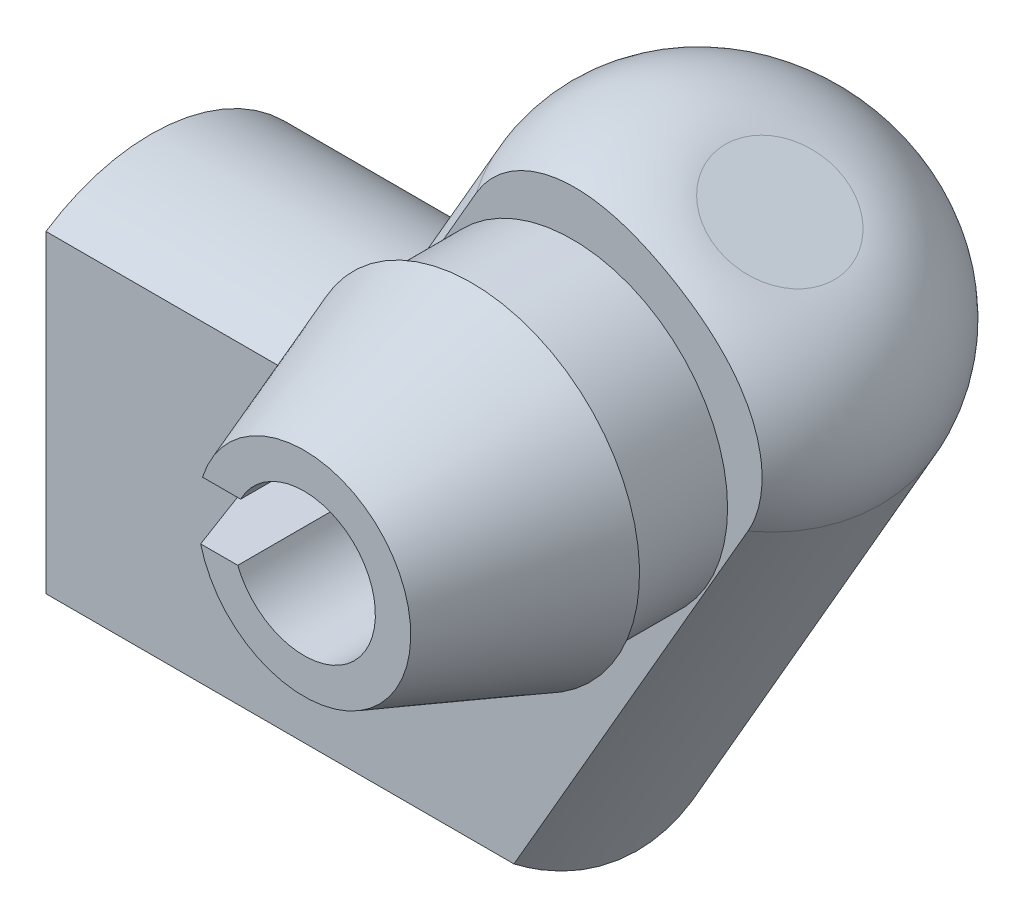
ISO-10303-21;
HEADER;
FILE_DESCRIPTION(('STEP AP214'),'2;1');
FILE_NAME('part.step','',(''),(''),'','','');
FILE_SCHEMA(('AUTOMOTIVE_DESIGN { 1 0 10303 214 1 1 1 1 }'));
ENDSEC;
DATA;
#1=APPLICATION_CONTEXT('core data for automotive mechanical design processes');
#2=APPLICATION_PROTOCOL_DEFINITION('international standard','automotive_design',2000,#1);
#3=PRODUCT_CONTEXT('',#1,'mechanical');
#4=PRODUCT('Part','Part','',(#3));
#5=PRODUCT_RELATED_PRODUCT_CATEGORY('part','',(#4));
#6=PRODUCT_DEFINITION_FORMATION('','',#4);
#7=PRODUCT_DEFINITION_CONTEXT('part definition',#1,'design');
#8=PRODUCT_DEFINITION('design','',#6,#7);
#9=PRODUCT_DEFINITION_SHAPE('','',#8);
#10=(LENGTH_UNIT() NAMED_UNIT(*) SI_UNIT(.MILLI.,.METRE.));
#11=(NAMED_UNIT(*) PLANE_ANGLE_UNIT() SI_UNIT($,.RADIAN.));
#12=(NAMED_UNIT(*) SI_UNIT($,.STERADIAN.) SOLID_ANGLE_UNIT());
#13=UNCERTAINTY_MEASURE_WITH_UNIT(LENGTH_MEASURE(1.E-05),#10,'distance_accuracy_value','');
#14=(GEOMETRIC_REPRESENTATION_CONTEXT(3) GLOBAL_UNCERTAINTY_ASSIGNED_CONTEXT((#13)) GLOBAL_UNIT_ASSIGNED_CONTEXT((#10,
#11,#12)) REPRESENTATION_CONTEXT('',''));
#15=CARTESIAN_POINT('',(0.,0.,0.));
#16=DIRECTION('',(0.,0.,1.));
#17=DIRECTION('',(1.,0.,0.));
#18=AXIS2_PLACEMENT_3D('',#15,#16,#17);
#19=CARTESIAN_POINT('',(3.,5.19615242270663,-20.));
#20=DIRECTION('',(0.5,0.866025403784439,0.));
#21=DIRECTION('',(0.,0.,1.));
#22=AXIS2_PLACEMENT_3D('',#19,#20,#21);
#23=PLANE('',#22);
#24=CARTESIAN_POINT('',(3.,5.19615242270663,-20.));
#25=DIRECTION('',(-0.5,-0.866025403784439,0.));
#26=DIRECTION('',(-0.866025403784439,0.5,0.));
#27=AXIS2_PLACEMENT_3D('',#24,#25,#26);
#28=CIRCLE('',#27,0.749999999999999);
#29=CARTESIAN_POINT('',(2.35048094716167,5.57115242270663,-20.));
#30=VERTEX_POINT('',#29);
#31=EDGE_CURVE('E203',#30,#30,#28,.T.);
#32=ORIENTED_EDGE('',*,*,#31,.F.);
#33=EDGE_LOOP('',(#32));
#34=FACE_BOUND('',#33,.T.);
#35=ADVANCED_FACE('F50',(#34),#23,.T.);
#36=CARTESIAN_POINT('',(-4.5,0.,-20.));
#37=DIRECTION('',(1.,0.,0.));
#38=DIRECTION('',(0.,0.,1.));
#39=AXIS2_PLACEMENT_3D('',#36,#37,#38);
#40=PLANE('',#39);
#41=CARTESIAN_POINT('',(-4.5,0.,-20.));
#42=DIRECTION('',(-1.,0.,0.));
#43=DIRECTION('',(0.,0.,1.));
#44=AXIS2_PLACEMENT_3D('',#41,#42,#43);
#45=CIRCLE('',#44,1.125);
#46=CARTESIAN_POINT('',(-4.5,0.,-18.875));
#47=VERTEX_POINT('',#46);
#48=EDGE_CURVE('E191',#47,#47,#45,.T.);
#49=ORIENTED_EDGE('',*,*,#48,.F.);
#50=EDGE_LOOP('',(#49));
#51=FACE_BOUND('',#50,.T.);
#52=CARTESIAN_POINT('',(-4.5,0.,-20.));
#53=DIRECTION('',(-1.,0.,0.));
#54=DIRECTION('',(0.,0.,1.));
#55=AXIS2_PLACEMENT_3D('',#52,#53,#54);
#56=CIRCLE('',#55,2.25);
#57=CARTESIAN_POINT('',(-4.5,1.87082869338697,-18.75));
#58=VERTEX_POINT('',#57);
#59=CARTESIAN_POINT('',(-4.5,-1.87082869338697,-18.75));
#60=VERTEX_POINT('',#59);
#61=EDGE_CURVE('E195',#58,#60,#56,.T.);
#62=ORIENTED_EDGE('',*,*,#61,.T.);
#63=DIRECTION('',(0.,-1.,0.));
#64=VECTOR('',#63,1.);
#65=CARTESIAN_POINT('',(-4.5,0.,-18.75));
#66=LINE('',#65,#64);
#67=EDGE_CURVE('E183',#58,#60,#66,.T.);
#68=ORIENTED_EDGE('',*,*,#67,.F.);
#69=EDGE_LOOP('',(#62,#68));
#70=FACE_BOUND('',#69,.T.);
#71=ADVANCED_FACE('F237',(#51,#70),#40,.F.);
#72=CARTESIAN_POINT('',(-1.47894191624432,-2.56160254037844,-20.));
#73=DIRECTION('',(0.5,0.866025403784439,0.));
#74=DIRECTION('',(-0.866025403784439,0.5,0.));
#75=AXIS2_PLACEMENT_3D('',#72,#73,#74);
#76=CYLINDRICAL_SURFACE('',#75,2.25);
#77=DIRECTION('',(0.5,0.866025403784439,0.));
#78=VECTOR('',#77,1.);
#79=CARTESIAN_POINT('',(0.141243258357642,-3.49701688707193,-18.75));
#80=LINE('',#79,#78);
#81=CARTESIAN_POINT('',(3.87018517460236,2.96169997032885,-18.75));
#82=VERTEX_POINT('',#81);
#83=CARTESIAN_POINT('',(1.08012344973464,-1.87082869338697,-18.75));
#84=VERTEX_POINT('',#83);
#85=EDGE_CURVE('E173',#82,#84,#80,.F.);
#86=ORIENTED_EDGE('',*,*,#85,.T.);
#87=CARTESIAN_POINT('',(0.,0.,-20.));
#88=DIRECTION('',(-0.866025403784439,-0.5,0.));
#89=DIRECTION('',(0.5,-0.866025403784439,0.));
#90=AXIS2_PLACEMENT_3D('',#87,#88,#89);
#91=ELLIPSE('',#90,2.59807621135332,2.25);
#92=CARTESIAN_POINT('',(-1.08012344973464,1.87082869338697,-18.75));
#93=VERTEX_POINT('',#92);
#94=EDGE_CURVE('E199',#84,#93,#91,.F.);
#95=ORIENTED_EDGE('',*,*,#94,.T.);
#96=DIRECTION('',(0.5,0.866025403784439,0.));
#97=VECTOR('',#96,1.);
#98=CARTESIAN_POINT('',(-3.09912709084629,-1.62618819368496,-18.75));
#99=LINE('',#98,#97);
#100=CARTESIAN_POINT('',(0.629814825398036,4.83252866372346,-18.75));
#101=VERTEX_POINT('',#100);
#102=EDGE_CURVE('E169',#93,#101,#99,.T.);
#103=ORIENTED_EDGE('',*,*,#102,.T.);
#104=CARTESIAN_POINT('',(2.25,3.89711431702997,-20.));
#105=DIRECTION('',(-0.5,-0.866025403784439,0.));
#106=DIRECTION('',(-0.866025403784439,0.5,0.));
#107=AXIS2_PLACEMENT_3D('',#104,#105,#106);
#108=CIRCLE('',#107,2.25);
#109=EDGE_CURVE('E207',#82,#101,#108,.F.);
#110=ORIENTED_EDGE('',*,*,#109,.F.);
#111=EDGE_LOOP('',(#86,#95,#103,#110));
#112=FACE_BOUND('',#111,.T.);
#113=ADVANCED_FACE('F233',(#112),#76,.T.);
#114=CARTESIAN_POINT('',(-4.5,0.,-20.));
#115=DIRECTION('',(1.,0.,0.));
#116=DIRECTION('',(0.,0.,1.));
#117=AXIS2_PLACEMENT_3D('',#114,#115,#116);
#118=CYLINDRICAL_SURFACE('',#117,2.25);
#119=DIRECTION('',(1.,0.,0.));
#120=VECTOR('',#119,1.);
#121=CARTESIAN_POINT('',(-4.5,-1.87082869338697,-18.75));
#122=LINE('',#121,#120);
#123=EDGE_CURVE('E180',#84,#60,#122,.F.);
#124=ORIENTED_EDGE('',*,*,#123,.T.);
#125=ORIENTED_EDGE('',*,*,#61,.F.);
#126=DIRECTION('',(1.,0.,0.));
#127=VECTOR('',#126,1.);
#128=CARTESIAN_POINT('',(-4.5,1.87082869338697,-18.75));
#129=LINE('',#128,#127);
#130=EDGE_CURVE('E177',#58,#93,#129,.T.);
#131=ORIENTED_EDGE('',*,*,#130,.T.);
#132=ORIENTED_EDGE('',*,*,#94,.F.);
#133=EDGE_LOOP('',(#124,#125,#131,#132));
#134=FACE_BOUND('',#133,.T.);
#135=ADVANCED_FACE('F230',(#134),#118,.T.);
#136=CARTESIAN_POINT('',(2.25,3.89711431702997,-20.));
#137=DIRECTION('',(0.5,0.866025403784439,0.));
#138=DIRECTION('',(-0.866025403784439,0.5,0.));
#139=AXIS2_PLACEMENT_3D('',#136,#137,#138);
#140=DEGENERATE_TOROIDAL_SURFACE('',#139,0.749999999999999,1.5,.T.);
#141=CARTESIAN_POINT('',(2.76882253032927,5.22301415914836,-18.75));
#142=CARTESIAN_POINT('',(2.83878601189705,5.18820996694728,-18.75));
#143=CARTESIAN_POINT('',(2.90752373776387,5.15094444709369,-18.75));
#144=CARTESIAN_POINT('',(3.04244775567369,5.07198939018065,-18.75));
#145=CARTESIAN_POINT('',(3.10863287233132,5.0302978474841,-18.75));
#146=CARTESIAN_POINT('',(3.23756384943671,4.94241510843654,-18.75));
#147=CARTESIAN_POINT('',(3.30032318479026,4.89624387905459,-18.75));
#148=CARTESIAN_POINT('',(3.42154530029649,4.79858700891688,-18.75));
#149=CARTESIAN_POINT('',(3.48001048750219,4.74710438495034,-18.75));
#150=CARTESIAN_POINT('',(3.60133951580253,4.62810121790016,-18.75));
#151=CARTESIAN_POINT('',(3.66304303436849,4.55937105525047,-18.75));
#152=CARTESIAN_POINT('',(3.77517523278892,4.41321792378568,-18.75));
#153=CARTESIAN_POINT('',(3.82561383076,4.33580269262962,-18.75));
#154=CARTESIAN_POINT('',(3.91256879516992,4.17237874978207,-18.75));
#155=CARTESIAN_POINT('',(3.94893873914843,4.08629082947665,-18.75));
#156=CARTESIAN_POINT('',(4.00416284000441,3.90857132837355,-18.75));
#157=CARTESIAN_POINT('',(4.02302070327241,3.81694092500415,-18.75));
#158=CARTESIAN_POINT('',(4.04007288762766,3.64396505627365,-18.75));
#159=CARTESIAN_POINT('',(4.04066033382444,3.56285334689579,-18.75));
#160=CARTESIAN_POINT('',(4.02661892544628,3.40197085098637,-18.75));
#161=CARTESIAN_POINT('',(4.01200212979591,3.32219905268627,-18.75));
#162=CARTESIAN_POINT('',(3.97000071930664,3.17470851145254,-18.75));
#163=CARTESIAN_POINT('',(3.94403742781129,3.10658177737824,-18.75));
#164=CARTESIAN_POINT('',(3.88066648004697,2.97588052894349,-18.75));
#165=CARTESIAN_POINT('',(3.8432615750651,2.91330468445971,-18.75));
#166=CARTESIAN_POINT('',(3.75952874460114,2.79749822624789,-18.75));
#167=CARTESIAN_POINT('',(3.71352541609736,2.74403228560709,-18.75));
#168=CARTESIAN_POINT('',(3.613273607413,2.64551471482593,-18.75));
#169=CARTESIAN_POINT('',(3.55902622434571,2.60046196683893,-18.75));
#170=CARTESIAN_POINT('',(3.44338325404398,2.51945348753679,-18.75));
#171=CARTESIAN_POINT('',(3.38192631961752,2.48358554493413,-18.75));
#172=CARTESIAN_POINT('',(3.25406921745253,2.42212662966504,-18.75));
#173=CARTESIAN_POINT('',(3.18766698270805,2.39653998321194,-18.75));
#174=CARTESIAN_POINT('',(3.04831667352323,2.3548114300683,-18.75));
#175=CARTESIAN_POINT('',(2.97520736074134,2.33921050620541,-18.75));
#176=CARTESIAN_POINT('',(2.82758314658712,2.31920960417219,-18.75));
#177=CARTESIAN_POINT('',(2.75306910570641,2.31480297982011,-18.75));
#178=CARTESIAN_POINT('',(2.57477994355988,2.31665407462239,-18.75));
#179=CARTESIAN_POINT('',(2.47104139778153,2.32779673803108,-18.75));
#180=CARTESIAN_POINT('',(2.31784845093846,2.35696611591871,-18.75));
#181=CARTESIAN_POINT('',(2.26706218530228,2.36881066537502,-18.75));
#182=CARTESIAN_POINT('',(2.16647438454394,2.3961511073304,-18.75));
#183=CARTESIAN_POINT('',(2.11667281181362,2.41164686008675,-18.75));
#184=CARTESIAN_POINT('',(1.98547402608927,2.45710336077601,-18.75));
#185=CARTESIAN_POINT('',(1.90504215690615,2.48983905544764,-18.75));
#186=CARTESIAN_POINT('',(1.74716900834115,2.56196522228046,-18.75));
#187=CARTESIAN_POINT('',(1.66973144815453,2.60136366332485,-18.75));
#188=CARTESIAN_POINT('',(1.51789007492057,2.68570008575924,-18.75));
#189=CARTESIAN_POINT('',(1.44348785149805,2.73064092140732,-18.75));
#190=CARTESIAN_POINT('',(1.29841936353685,2.82610728164475,-18.75));
#191=CARTESIAN_POINT('',(1.22774923874489,2.87662686178315,-18.75));
#192=CARTESIAN_POINT('',(1.11932337803505,2.96224002368142,-18.75));
#193=CARTESIAN_POINT('',(1.07990127203737,2.99521910875571,-18.75));
#194=CARTESIAN_POINT('',(1.00328343054179,3.06365770781396,-18.75));
#195=CARTESIAN_POINT('',(0.966087638173963,3.09911715838815,-18.75));
#196=CARTESIAN_POINT('',(0.858826856983155,3.20921873994056,-18.75));
#197=CARTESIAN_POINT('',(0.792707427791544,3.28787473087939,-18.75));
#198=CARTESIAN_POINT('',(0.68562889611132,3.44125583495667,-18.75));
#199=CARTESIAN_POINT('',(0.64229691990963,3.51431669881696,-18.75));
#200=CARTESIAN_POINT('',(0.568254062409525,3.66675883312603,-18.75));
#201=CARTESIAN_POINT('',(0.53755502102077,3.74614594991817,-18.75));
#202=CARTESIAN_POINT('',(0.490773612520746,3.90970430864653,-18.75));
#203=CARTESIAN_POINT('',(0.474782215272155,3.99390194905053,-18.75));
#204=CARTESIAN_POINT('',(0.459214401015467,4.16379931493219,-18.75));
#205=CARTESIAN_POINT('',(0.459625169606661,4.24949781551994,-18.75));
#206=CARTESIAN_POINT('',(0.476379752691128,4.40923016088565,-18.75));
#207=CARTESIAN_POINT('',(0.490866028825034,4.48346200520048,-18.75));
#208=CARTESIAN_POINT('',(0.532875619484056,4.62813911661286,-18.75));
#209=CARTESIAN_POINT('',(0.560394110820189,4.6985857738671,-18.75));
#210=CARTESIAN_POINT('',(0.625714671446492,4.82944371746596,-18.75));
#211=CARTESIAN_POINT('',(0.662828181525319,4.89020000899697,-18.75));
#212=CARTESIAN_POINT('',(0.746816201990237,5.00453098249614,-18.75));
#213=CARTESIAN_POINT('',(0.793689256457138,5.05810673369295,-18.75));
#214=CARTESIAN_POINT('',(0.895302353570423,5.15618632793598,-18.75));
#215=CARTESIAN_POINT('',(0.949969258523963,5.20076611508682,-18.75));
#216=CARTESIAN_POINT('',(1.06582739223811,5.28040584937879,-18.75));
#217=CARTESIAN_POINT('',(1.12701870618722,5.31546567219758,-18.75));
#218=CARTESIAN_POINT('',(1.25603840457472,5.37634503130925,-18.75));
#219=CARTESIAN_POINT('',(1.32400934914753,5.40186139997097,-18.75));
#220=CARTESIAN_POINT('',(1.46308312994784,5.442011805509,-18.75));
#221=CARTESIAN_POINT('',(1.5341871616844,5.45664164959304,-18.75));
#222=CARTESIAN_POINT('',(1.68338662985202,5.47608729487748,-18.75));
#223=CARTESIAN_POINT('',(1.76159229052823,5.48004126518966,-18.75));
#224=CARTESIAN_POINT('',(1.91766870564071,5.47668404773504,-18.75));
#225=CARTESIAN_POINT('',(1.99553959112014,5.46937776620781,-18.75));
#226=CARTESIAN_POINT('',(2.13312260540774,5.4476186907361,-18.75));
#227=CARTESIAN_POINT('',(2.19314734742679,5.43503470512446,-18.75));
#228=CARTESIAN_POINT('',(2.3118885286075,5.40466430444159,-18.75));
#229=CARTESIAN_POINT('',(2.37060418508865,5.38687486236935,-18.75));
#230=CARTESIAN_POINT('',(2.4868229581396,5.34683175289038,-18.75));
#231=CARTESIAN_POINT('',(2.54431790741139,5.32455471193729,-18.75));
#232=CARTESIAN_POINT('',(2.65773657108753,5.27636612527919,-18.75));
#233=CARTESIAN_POINT('',(2.71366053843083,5.25045516873231,-18.75));
#234=CARTESIAN_POINT('',(2.76882253032927,5.22301415914836,-18.75));
#235=B_SPLINE_CURVE_WITH_KNOTS('',3,(#141,#142,#143,#144,#145,#146,#147,#148,#149,#150,#151,
#152,#153,#154,#155,#156,#157,#158,#159,#160,#161,#162,#163,#164,#165,#166,#167,#168,#169,#170,
#171,#172,#173,#174,#175,#176,#177,#178,#179,#180,#181,#182,#183,#184,#185,#186,#187,#188,#189,
#190,#191,#192,#193,#194,#195,#196,#197,#198,#199,#200,#201,#202,#203,#204,#205,#206,#207,#208,
#209,#210,#211,#212,#213,#214,#215,#216,#217,#218,#219,#220,#221,#222,#223,#224,#225,#226,#227,
#228,#229,#230,#231,#232,#233,#234),.UNSPECIFIED.,.T.,.F.,(4,2,2,2,2,2,2,2,2,2,2,2,2,2,2,2,2,2,
2,2,2,2,2,2,2,2,2,2,2,2,2,2,2,2,2,2,2,2,2,2,2,2,2,2,2,2,4),(0.,0.23438798440669,
0.46888263799245,0.702376323444494,0.935738110731071,1.21190565453802,1.48782908162622,
1.76655157149598,2.04521505695532,2.28719943446279,2.5289920333847,2.74663043881367,
2.96421655129943,3.17482534342452,3.38540613237549,3.59793026544326,3.81054373202732,
4.03387245347089,4.25706855111464,4.56819011471147,4.7245378626682,4.88087962768977,
5.1409758739427,5.40138543370549,5.66192966529886,5.92219890419679,6.07629229186219,
6.23038174161763,6.5371347976684,6.79094892089219,7.04500038637828,7.30061284854124,
7.55602561412674,7.78175030084015,8.00739151264139,8.21995324568357,8.43248329166654,
8.64313626844578,8.85379199603479,9.07066334109022,9.28761816793463,9.52162679979927,
9.75553349985253,9.93927363837258,10.1231208358295,10.3079515779011,10.4927523883697),.UNSPECIFIED.);
#236=EDGE_CURVE('E60',#101,#82,#235,.T.);
#237=ORIENTED_EDGE('',*,*,#236,.T.);
#238=ORIENTED_EDGE('',*,*,#109,.T.);
#239=EDGE_LOOP('',(#237,#238));
#240=FACE_BOUND('',#239,.T.);
#241=ORIENTED_EDGE('',*,*,#31,.T.);
#242=EDGE_LOOP('',(#241));
#243=FACE_BOUND('',#242,.T.);
#244=ADVANCED_FACE('F52',(#240,#243),#140,.T.);
#245=CARTESIAN_POINT('',(1.2,0.,-20.));
#246=DIRECTION('',(-1.,0.,0.));
#247=DIRECTION('',(0.,0.,-1.));
#248=AXIS2_PLACEMENT_3D('',#245,#246,#247);
#249=PLANE('',#248);
#250=CARTESIAN_POINT('',(1.2,0.,-20.));
#251=DIRECTION('',(1.,0.,0.));
#252=DIRECTION('',(0.,0.,-1.));
#253=AXIS2_PLACEMENT_3D('',#250,#251,#252);
#254=CIRCLE('',#253,1.125);
#255=CARTESIAN_POINT('',(1.2,0.,-21.125));
#256=VERTEX_POINT('',#255);
#257=EDGE_CURVE('E187',#256,#256,#254,.T.);
#258=ORIENTED_EDGE('',*,*,#257,.F.);
#259=EDGE_LOOP('',(#258));
#260=FACE_BOUND('',#259,.T.);
#261=ADVANCED_FACE('F225',(#260),#249,.T.);
#262=CARTESIAN_POINT('',(-5.5,0.,-20.));
#263=DIRECTION('',(1.,0.,0.));
#264=DIRECTION('',(0.,0.,1.));
#265=AXIS2_PLACEMENT_3D('',#262,#263,#264);
#266=CYLINDRICAL_SURFACE('',#265,1.125);
#267=ORIENTED_EDGE('',*,*,#48,.T.);
#268=EDGE_LOOP('',(#267));
#269=FACE_BOUND('',#268,.T.);
#270=ORIENTED_EDGE('',*,*,#257,.T.);
#271=EDGE_LOOP('',(#270));
#272=FACE_BOUND('',#271,.T.);
#273=ADVANCED_FACE('F220',(#269,#272),#266,.F.);
#274=CARTESIAN_POINT('',(0.,0.,-18.75));
#275=DIRECTION('',(0.,0.,-1.));
#276=DIRECTION('',(1.,0.,0.));
#277=AXIS2_PLACEMENT_3D('',#274,#275,#276);
#278=PLANE('',#277);
#279=CARTESIAN_POINT('',(1.77741445898117,3.07857214906294,-18.75));
#280=DIRECTION('',(0.,0.,1.));
#281=DIRECTION('',(1.,0.,0.));
#282=AXIS2_PLACEMENT_3D('',#279,#280,#281);
#283=CIRCLE('',#282,1.85);
#284=CARTESIAN_POINT('',(3.62741445898117,3.07857214906294,-18.75));
#285=VERTEX_POINT('',#284);
#286=EDGE_CURVE('E11',#285,#285,#283,.F.);
#287=ORIENTED_EDGE('',*,*,#286,.T.);
#288=EDGE_LOOP('',(#287));
#289=FACE_BOUND('',#288,.T.);
#290=ORIENTED_EDGE('',*,*,#130,.F.);
#291=ORIENTED_EDGE('',*,*,#67,.T.);
#292=ORIENTED_EDGE('',*,*,#123,.F.);
#293=ORIENTED_EDGE('',*,*,#85,.F.);
#294=ORIENTED_EDGE('',*,*,#236,.F.);
#295=ORIENTED_EDGE('',*,*,#102,.F.);
#296=EDGE_LOOP('',(#290,#291,#292,#293,#294,#295));
#297=FACE_BOUND('',#296,.T.);
#298=ADVANCED_FACE('F214',(#289,#297),#278,.F.);
#299=CARTESIAN_POINT('',(1.77741445898117,3.07857214906294,-17.55));
#300=DIRECTION('',(0.,0.,-1.));
#301=DIRECTION('',(1.,0.,0.));
#302=AXIS2_PLACEMENT_3D('',#299,#300,#301);
#303=CYLINDRICAL_SURFACE('',#302,1.85);
#304=CARTESIAN_POINT('',(1.77741445898117,3.07857214906294,-17.55));
#305=DIRECTION('',(0.,0.,-1.));
#306=DIRECTION('',(-1.,0.,0.));
#307=AXIS2_PLACEMENT_3D('',#304,#305,#306);
#308=CIRCLE('',#307,1.85);
#309=CARTESIAN_POINT('',(-0.0314269360411833,3.46663504042667,-17.55));
#310=VERTEX_POINT('',#309);
#311=CARTESIAN_POINT('',(-0.0460973288215942,2.76663504042667,-17.55));
#312=VERTEX_POINT('',#311);
#313=EDGE_CURVE('E165',#310,#312,#308,.T.);
#314=ORIENTED_EDGE('',*,*,#313,.T.);
#315=DIRECTION('',(0.,0.,-1.));
#316=VECTOR('',#315,1.);
#317=CARTESIAN_POINT('',(-0.0460973288215942,2.76663504042667,-17.55));
#318=LINE('',#317,#316);
#319=CARTESIAN_POINT('',(-0.0460973288215942,2.76663504042667,-17.95));
#320=VERTEX_POINT('',#319);
#321=EDGE_CURVE('E479',#320,#312,#318,.F.);
#322=ORIENTED_EDGE('',*,*,#321,.F.);
#323=CARTESIAN_POINT('',(1.77741445898117,3.07857214906294,-17.95));
#324=DIRECTION('',(0.,0.,-1.));
#325=DIRECTION('',(-1.,0.,0.));
#326=AXIS2_PLACEMENT_3D('',#323,#324,#325);
#327=CIRCLE('',#326,1.85);
#328=CARTESIAN_POINT('',(-0.0314269360411833,3.46663504042667,-17.95));
#329=VERTEX_POINT('',#328);
#330=EDGE_CURVE('E149',#320,#329,#327,.T.);
#331=ORIENTED_EDGE('',*,*,#330,.T.);
#332=DIRECTION('',(0.,0.,-1.));
#333=VECTOR('',#332,1.);
#334=CARTESIAN_POINT('',(-0.0314269360411833,3.46663504042667,-17.55));
#335=LINE('',#334,#333);
#336=EDGE_CURVE('E156',#310,#329,#335,.T.);
#337=ORIENTED_EDGE('',*,*,#336,.F.);
#338=EDGE_LOOP('',(#314,#322,#331,#337));
#339=FACE_BOUND('',#338,.T.);
#340=ORIENTED_EDGE('',*,*,#286,.F.);
#341=EDGE_LOOP('',(#340));
#342=FACE_BOUND('',#341,.T.);
#343=ADVANCED_FACE('F219',(#339,#342),#303,.T.);
#344=CARTESIAN_POINT('',(1.77741445898117,3.07857214906294,-17.55));
#345=DIRECTION('',(0.,0.,-1.));
#346=DIRECTION('',(-1.,0.,0.));
#347=AXIS2_PLACEMENT_3D('',#344,#345,#346);
#348=CONICAL_SURFACE('',#347,2.,0.349065850398867);
#349=CARTESIAN_POINT('',(1.77741445898117,3.07857214906294,-15.55));
#350=DIRECTION('',(0.,0.,-1.));
#351=DIRECTION('',(-1.,0.,0.));
#352=AXIS2_PLACEMENT_3D('',#349,#350,#351);
#353=CIRCLE('',#352,1.27205953146759);
#354=CARTESIAN_POINT('',(0.565992714111131,3.46663504042667,-15.55));
#355=VERTEX_POINT('',#354);
#356=CARTESIAN_POINT('',(0.544194814370694,2.76663504042667,-15.55));
#357=VERTEX_POINT('',#356);
#358=EDGE_CURVE('E162',#355,#357,#353,.T.);
#359=ORIENTED_EDGE('',*,*,#358,.T.);
#360=CARTESIAN_POINT('',(-1.07864854459014,2.76663504042667,-19.9486776721364));
#361=CARTESIAN_POINT('',(-0.95052815923996,2.76663504042667,-19.5987991444344));
#362=CARTESIAN_POINT('',(-0.822346697366791,2.76663504042667,-19.2489427704648));
#363=CARTESIAN_POINT('',(-0.565713888791098,2.76663504042667,-18.5493700470455));
#364=CARTESIAN_POINT('',(-0.437262571333337,2.76663504042667,-18.1996536868651));
#365=CARTESIAN_POINT('',(-0.179962370267813,2.76663504042667,-17.5005106236382));
#366=CARTESIAN_POINT('',(-0.0511136469239965,2.76663504042667,-17.1510838616007));
#367=CARTESIAN_POINT('',(0.207386554675265,2.76663504042667,-16.452486009127));
#368=CARTESIAN_POINT('',(0.337038113211084,2.76663504042667,-16.1033149482952));
#369=CARTESIAN_POINT('',(0.508614031963517,2.76663504042667,-15.6447634885623));
#370=CARTESIAN_POINT('',(0.549749811122545,2.76663504042667,-15.5350882502084));
#371=CARTESIAN_POINT('',(0.632263341372217,2.76663504042667,-15.3158323461177));
#372=CARTESIAN_POINT('',(0.67364108555031,2.76663504042667,-15.2062516777808));
#373=CARTESIAN_POINT('',(0.7567190496069,2.76663504042667,-14.9872442112718));
#374=CARTESIAN_POINT('',(0.798419185177144,2.76663504042667,-14.8778173811636));
#375=CARTESIAN_POINT('',(0.882305992538704,2.76663504042667,-14.6591382092452));
#376=CARTESIAN_POINT('',(0.924492710556253,2.76663504042667,-14.5498858851548));
#377=CARTESIAN_POINT('',(1.00962894703889,2.76663504042667,-14.331577742276));
#378=CARTESIAN_POINT('',(1.05257904288961,2.76663504042667,-14.2225221474959));
#379=CARTESIAN_POINT('',(1.11791341893438,2.76663504042667,-14.0593217323865));
#380=CARTESIAN_POINT('',(1.1398396469458,2.76663504042667,-14.0049937350266));
#381=CARTESIAN_POINT('',(1.18410869697334,2.76663504042667,-13.8965019662743));
#382=CARTESIAN_POINT('',(1.20645155353304,2.76663504042667,-13.8423382089361));
#383=CARTESIAN_POINT('',(1.25173779577936,2.76663504042667,-13.7341904689224));
#384=CARTESIAN_POINT('',(1.27468182677879,2.76663504042667,-13.6802067559461));
#385=CARTESIAN_POINT('',(1.32140045606111,2.76663504042667,-13.5726112265447));
#386=CARTESIAN_POINT('',(1.34517486307177,2.76663504042667,-13.5189993278403));
#387=CARTESIAN_POINT('',(1.38183619050424,2.76663504042667,-13.4390007329976));
#388=CARTESIAN_POINT('',(1.39423078817247,2.76663504042667,-13.4123889821625));
#389=CARTESIAN_POINT('',(1.41945298605845,2.76663504042667,-13.3593748240011));
#390=CARTESIAN_POINT('',(1.43228053718246,2.76663504042667,-13.3329723933561));
#391=CARTESIAN_POINT('',(1.4585158180032,2.76663504042667,-13.2804276381407));
#392=CARTESIAN_POINT('',(1.47192400214013,2.76663504042667,-13.2542855377465));
#393=CARTESIAN_POINT('',(1.49957490517488,2.76663504042667,-13.2024351153322));
#394=CARTESIAN_POINT('',(1.51381795054813,2.76663504042667,-13.1767269681412));
#395=CARTESIAN_POINT('',(1.5286052516349,2.76663504042667,-13.1513223278637));
#396=B_SPLINE_CURVE_WITH_KNOTS('',3,(#360,#361,#362,#363,#364,#365,#366,#367,#368,#369,#370,
#371,#372,#373,#374,#375,#376,#377,#378,#379,#380,#381,#382,#383,#384,#385,#386,#387,#388,#389,
#390,#391,#392,#393,#394,#395),.UNSPECIFIED.,.F.,.F.,(4,2,2,2,2,2,2,2,2,2,2,2,2,2,2,2,2,4),(0.,
1.11779653859015,2.23547761690309,3.35275520627805,4.47014638374856,4.82155375516547,
5.17295113601483,5.52425953827073,5.87560159497006,6.22722176813069,6.40297789594007,
6.57874866144094,6.75471652875163,6.93064412680584,7.01871091177992,7.10676774395799,
7.19489478669907,7.28305652477314),.UNSPECIFIED.);
#397=CARTESIAN_POINT('',(-0.198109582951915,2.76663504042667,-17.55));
#398=VERTEX_POINT('',#397);
#399=EDGE_CURVE('E140',#398,#357,#396,.T.);
#400=ORIENTED_EDGE('',*,*,#399,.F.);
#401=CARTESIAN_POINT('',(1.77741445898117,3.07857214906294,-17.55));
#402=DIRECTION('',(0.,0.,-1.));
#403=DIRECTION('',(-1.,0.,0.));
#404=AXIS2_PLACEMENT_3D('',#401,#402,#403);
#405=CIRCLE('',#404,2.);
#406=CARTESIAN_POINT('',(-0.184576160860427,3.46663504042667,-17.55));
#407=VERTEX_POINT('',#406);
#408=EDGE_CURVE('E153',#407,#398,#405,.T.);
#409=ORIENTED_EDGE('',*,*,#408,.F.);
#410=CARTESIAN_POINT('',(1.68458141656166,3.46663504042667,-13.1513223279112));
#411=CARTESIAN_POINT('',(1.67377089174622,3.46663504042667,-13.1582682292691));
#412=CARTESIAN_POINT('',(1.66349283560153,3.46663504042667,-13.1659418322235));
#413=CARTESIAN_POINT('',(1.6438629295756,3.46663504042667,-13.182312826902));
#414=CARTESIAN_POINT('',(1.63450676620371,3.46663504042667,-13.1910049887052));
#415=CARTESIAN_POINT('',(1.60767523511878,3.46663504042667,-13.217873685792));
#416=CARTESIAN_POINT('',(1.59119513958676,3.46663504042667,-13.2370217432003));
#417=CARTESIAN_POINT('',(1.56102708471366,3.46663504042667,-13.2752849019055));
#418=CARTESIAN_POINT('',(1.5472256164591,3.46663504042667,-13.2943144076609));
#419=CARTESIAN_POINT('',(1.52066853562139,3.46663504042667,-13.3330960777147));
#420=CARTESIAN_POINT('',(1.50791331514073,3.46663504042667,-13.3528485089696));
#421=CARTESIAN_POINT('',(1.47073880628135,3.46663504042667,-13.4128536246753));
#422=CARTESIAN_POINT('',(1.44745043510747,3.46663504042667,-13.4537995343733));
#423=CARTESIAN_POINT('',(1.40219050403798,3.46663504042667,-13.5374259440971));
#424=CARTESIAN_POINT('',(1.38025364743063,3.46663504042667,-13.5801247092297));
#425=CARTESIAN_POINT('',(1.33760040717552,3.46663504042667,-13.6660617345209));
#426=CARTESIAN_POINT('',(1.31688260366099,3.46663504042667,-13.7092992930001));
#427=CARTESIAN_POINT('',(1.25655651423559,3.46663504042667,-13.8382534524714));
#428=CARTESIAN_POINT('',(1.2181091461334,3.46663504042667,-13.9245094058387));
#429=CARTESIAN_POINT('',(1.14291439907062,3.46663504042667,-14.0977634990466));
#430=CARTESIAN_POINT('',(1.106167292292,3.46663504042667,-14.1847617550947));
#431=CARTESIAN_POINT('',(1.03371992130256,3.46663504042667,-14.3592764204588));
#432=CARTESIAN_POINT('',(0.998020544579731,3.46663504042667,-14.4467931976429));
#433=CARTESIAN_POINT('',(0.927345442545033,3.46663504042667,-14.6221100213583));
#434=CARTESIAN_POINT('',(0.892369666433566,3.46663504042667,-14.7099100475008));
#435=CARTESIAN_POINT('',(0.789123888919528,3.46663504042667,-14.9712447184085));
#436=CARTESIAN_POINT('',(0.721576090819099,3.46663504042667,-15.145064312138));
#437=CARTESIAN_POINT('',(0.587581723677891,3.46663504042667,-15.4930519727243));
#438=CARTESIAN_POINT('',(0.521134760474618,3.46663504042667,-15.6672198886829));
#439=CARTESIAN_POINT('',(0.326833969640066,3.46663504042667,-16.1794120212995));
#440=CARTESIAN_POINT('',(0.199887267586225,3.46663504042667,-16.5177800453424));
#441=CARTESIAN_POINT('',(-0.0528856794299782,3.46663504042667,-17.1949927993532));
#442=CARTESIAN_POINT('',(-0.178711745287705,3.46663504042667,-17.5338375958438));
#443=CARTESIAN_POINT('',(-0.432252308727382,3.46663504042667,-18.2186219615926));
#444=CARTESIAN_POINT('',(-0.559953542584918,3.46663504042667,-18.5645664426848));
#445=CARTESIAN_POINT('',(-0.814902483953607,3.46663504042667,-19.2565552084577));
#446=CARTESIAN_POINT('',(-0.942150265434495,3.46663504042667,-19.602599465876));
#447=CARTESIAN_POINT('',(-1.0693043245413,3.46663504042667,-19.9486776721363));
#448=B_SPLINE_CURVE_WITH_KNOTS('',3,(#410,#411,#412,#413,#414,#415,#416,#417,#418,#419,#420,
#421,#422,#423,#424,#425,#426,#427,#428,#429,#430,#431,#432,#433,#434,#435,#436,#437,#438,#439,
#440,#441,#442,#443,#444,#445,#446,#447),.UNSPECIFIED.,.F.,.F.,(4,2,2,2,2,2,2,2,2,2,2,2,2,2,2,2,
2,2,4),(0.,0.0384384883023404,0.0766876099489762,0.152294850304922,0.222781544066414,
0.293294534579253,0.43452248499746,0.578515166135122,0.722336672385861,1.00560630779833,
1.28892113391368,1.57246939591833,1.85599768370687,2.41543897214837,2.97467541939286,
4.05886267520497,5.14322020799426,6.24950481503369,7.35559984020088),.UNSPECIFIED.);
#449=EDGE_CURVE('E484',#355,#407,#448,.T.);
#450=ORIENTED_EDGE('',*,*,#449,.F.);
#451=EDGE_LOOP('',(#359,#400,#409,#450));
#452=FACE_BOUND('',#451,.T.);
#453=ADVANCED_FACE('F276',(#452),#348,.T.);
#454=CARTESIAN_POINT('',(1.77741445898117,3.07857214906294,-15.55));
#455=DIRECTION('',(0.,0.,1.));
#456=DIRECTION('',(-1.,0.,0.));
#457=AXIS2_PLACEMENT_3D('',#454,#455,#456);
#458=PLANE('',#457);
#459=DIRECTION('',(1.,0.,0.));
#460=VECTOR('',#459,1.);
#461=CARTESIAN_POINT('',(1.10130839118897,3.46663504042667,-15.55));
#462=LINE('',#461,#460);
#463=CARTESIAN_POINT('',(1.02116900124511,3.46663504042667,-15.55));
#464=VERTEX_POINT('',#463);
#465=EDGE_CURVE('E145',#355,#464,#462,.T.);
#466=ORIENTED_EDGE('',*,*,#465,.T.);
#467=CARTESIAN_POINT('',(1.77741445898117,3.07857214906294,-15.55));
#468=DIRECTION('',(0.,0.,-1.));
#469=DIRECTION('',(-1.,0.,0.));
#470=AXIS2_PLACEMENT_3D('',#467,#468,#469);
#471=CIRCLE('',#470,0.85);
#472=CARTESIAN_POINT('',(0.986721572801182,2.76663504042667,-15.55));
#473=VERTEX_POINT('',#472);
#474=EDGE_CURVE('E128',#464,#473,#471,.T.);
#475=ORIENTED_EDGE('',*,*,#474,.T.);
#476=DIRECTION('',(-1.,0.,0.));
#477=VECTOR('',#476,1.);
#478=CARTESIAN_POINT('',(1.10130839118897,2.76663504042667,-15.55));
#479=LINE('',#478,#477);
#480=EDGE_CURVE('E137',#473,#357,#479,.T.);
#481=ORIENTED_EDGE('',*,*,#480,.T.);
#482=ORIENTED_EDGE('',*,*,#358,.F.);
#483=EDGE_LOOP('',(#466,#475,#481,#482));
#484=FACE_BOUND('',#483,.T.);
#485=ADVANCED_FACE('F147',(#484),#458,.T.);
#486=CARTESIAN_POINT('',(1.77741445898117,3.07857214906294,-17.55));
#487=DIRECTION('',(0.,0.,1.));
#488=DIRECTION('',(-1.,0.,0.));
#489=AXIS2_PLACEMENT_3D('',#486,#487,#488);
#490=PLANE('',#489);
#491=ORIENTED_EDGE('',*,*,#408,.T.);
#492=DIRECTION('',(-1.,0.,0.));
#493=VECTOR('',#492,1.);
#494=CARTESIAN_POINT('',(1.77741445898117,2.76663504042667,-17.55));
#495=LINE('',#494,#493);
#496=EDGE_CURVE('E134',#312,#398,#495,.T.);
#497=ORIENTED_EDGE('',*,*,#496,.F.);
#498=ORIENTED_EDGE('',*,*,#313,.F.);
#499=DIRECTION('',(1.,0.,0.));
#500=VECTOR('',#499,1.);
#501=CARTESIAN_POINT('',(1.77741445898117,3.46663504042667,-17.55));
#502=LINE('',#501,#500);
#503=EDGE_CURVE('E493',#407,#310,#502,.T.);
#504=ORIENTED_EDGE('',*,*,#503,.F.);
#505=EDGE_LOOP('',(#491,#497,#498,#504));
#506=FACE_BOUND('',#505,.T.);
#507=ADVANCED_FACE('F289',(#506),#490,.F.);
#508=CARTESIAN_POINT('',(1.77741445898117,3.07857214906294,-17.95));
#509=DIRECTION('',(0.,0.,1.));
#510=DIRECTION('',(-1.,0.,0.));
#511=AXIS2_PLACEMENT_3D('',#508,#509,#510);
#512=CYLINDRICAL_SURFACE('',#511,0.85);
#513=CARTESIAN_POINT('',(1.77741445898117,3.07857214906294,-17.95));
#514=DIRECTION('',(0.,0.,-1.));
#515=DIRECTION('',(-1.,0.,0.));
#516=AXIS2_PLACEMENT_3D('',#513,#514,#515);
#517=CIRCLE('',#516,0.85);
#518=CARTESIAN_POINT('',(1.02116900124511,3.46663504042667,-17.95));
#519=VERTEX_POINT('',#518);
#520=CARTESIAN_POINT('',(0.986721572801182,2.76663504042667,-17.95));
#521=VERTEX_POINT('',#520);
#522=EDGE_CURVE('E131',#519,#521,#517,.T.);
#523=ORIENTED_EDGE('',*,*,#522,.T.);
#524=DIRECTION('',(0.,0.,1.));
#525=VECTOR('',#524,1.);
#526=CARTESIAN_POINT('',(0.986721572801182,2.76663504042667,-17.95));
#527=LINE('',#526,#525);
#528=EDGE_CURVE('E124',#473,#521,#527,.F.);
#529=ORIENTED_EDGE('',*,*,#528,.F.);
#530=ORIENTED_EDGE('',*,*,#474,.F.);
#531=DIRECTION('',(0.,0.,1.));
#532=VECTOR('',#531,1.);
#533=CARTESIAN_POINT('',(1.02116900124511,3.46663504042667,-17.95));
#534=LINE('',#533,#532);
#535=EDGE_CURVE('E509',#519,#464,#534,.T.);
#536=ORIENTED_EDGE('',*,*,#535,.F.);
#537=EDGE_LOOP('',(#523,#529,#530,#536));
#538=FACE_BOUND('',#537,.T.);
#539=ADVANCED_FACE('F126',(#538),#512,.F.);
#540=CARTESIAN_POINT('',(1.77741445898117,3.07857214906294,-17.95));
#541=DIRECTION('',(0.,0.,1.));
#542=DIRECTION('',(-1.,0.,0.));
#543=AXIS2_PLACEMENT_3D('',#540,#541,#542);
#544=PLANE('',#543);
#545=ORIENTED_EDGE('',*,*,#522,.F.);
#546=DIRECTION('',(1.,0.,0.));
#547=VECTOR('',#546,1.);
#548=CARTESIAN_POINT('',(1.10130839118897,3.46663504042667,-17.95));
#549=LINE('',#548,#547);
#550=EDGE_CURVE('E67',#329,#519,#549,.T.);
#551=ORIENTED_EDGE('',*,*,#550,.F.);
#552=ORIENTED_EDGE('',*,*,#330,.F.);
#553=DIRECTION('',(-1.,0.,0.));
#554=VECTOR('',#553,1.);
#555=CARTESIAN_POINT('',(1.10130839118897,2.76663504042667,-17.95));
#556=LINE('',#555,#554);
#557=EDGE_CURVE('E501',#521,#320,#556,.T.);
#558=ORIENTED_EDGE('',*,*,#557,.F.);
#559=EDGE_LOOP('',(#545,#551,#552,#558));
#560=FACE_BOUND('',#559,.T.);
#561=ADVANCED_FACE('F303',(#560),#544,.T.);
#562=CARTESIAN_POINT('',(1.10130839118897,3.46663504042667,-17.95));
#563=DIRECTION('',(0.,1.,0.));
#564=DIRECTION('',(0.,0.,-1.));
#565=AXIS2_PLACEMENT_3D('',#562,#563,#564);
#566=PLANE('',#565);
#567=ORIENTED_EDGE('',*,*,#503,.T.);
#568=ORIENTED_EDGE('',*,*,#336,.T.);
#569=ORIENTED_EDGE('',*,*,#550,.T.);
#570=ORIENTED_EDGE('',*,*,#535,.T.);
#571=ORIENTED_EDGE('',*,*,#465,.F.);
#572=ORIENTED_EDGE('',*,*,#449,.T.);
#573=EDGE_LOOP('',(#567,#568,#569,#570,#571,#572));
#574=FACE_BOUND('',#573,.T.);
#575=ADVANCED_FACE('F310',(#574),#566,.F.);
#576=CARTESIAN_POINT('',(1.10130839118897,2.76663504042667,-17.95));
#577=DIRECTION('',(0.,-1.,0.));
#578=DIRECTION('',(0.,0.,1.));
#579=AXIS2_PLACEMENT_3D('',#576,#577,#578);
#580=PLANE('',#579);
#581=ORIENTED_EDGE('',*,*,#557,.T.);
#582=ORIENTED_EDGE('',*,*,#321,.T.);
#583=ORIENTED_EDGE('',*,*,#496,.T.);
#584=ORIENTED_EDGE('',*,*,#399,.T.);
#585=ORIENTED_EDGE('',*,*,#480,.F.);
#586=ORIENTED_EDGE('',*,*,#528,.T.);
#587=EDGE_LOOP('',(#581,#582,#583,#584,#585,#586));
#588=FACE_BOUND('',#587,.T.);
#589=ADVANCED_FACE('F138',(#588),#580,.F.);
#590=CLOSED_SHELL('',(#35,#71,#113,#135,#244,#261,#273,#298,#343,#453,#485,#507,#539,#561,#575,#589));
#591=MANIFOLD_SOLID_BREP('B2',#590);
#592=ADVANCED_BREP_SHAPE_REPRESENTATION('',(#18,#591),#14);
#593=SHAPE_DEFINITION_REPRESENTATION(#9,#592);
ENDSEC;
END-ISO-10303-21;
